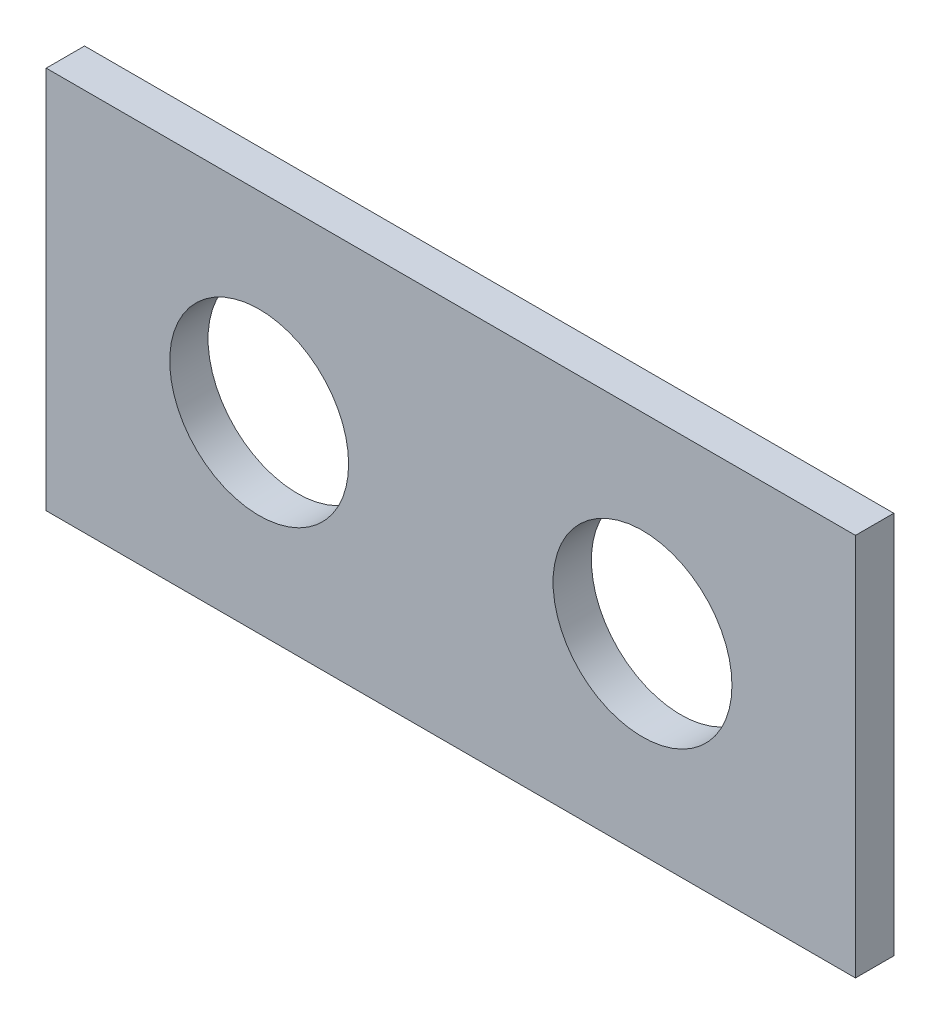
ISO-10303-21;
HEADER;
FILE_DESCRIPTION(('STEP AP214'),'2;1');
FILE_NAME('part.step','',(''),(''),'','','');
FILE_SCHEMA(('AUTOMOTIVE_DESIGN { 1 0 10303 214 1 1 1 1 }'));
ENDSEC;
DATA;
#1=APPLICATION_CONTEXT('core data for automotive mechanical design processes');
#2=APPLICATION_PROTOCOL_DEFINITION('international standard','automotive_design',2000,#1);
#3=PRODUCT_CONTEXT('',#1,'mechanical');
#4=PRODUCT('Part','Part','',(#3));
#5=PRODUCT_RELATED_PRODUCT_CATEGORY('part','',(#4));
#6=PRODUCT_DEFINITION_FORMATION('','',#4);
#7=PRODUCT_DEFINITION_CONTEXT('part definition',#1,'design');
#8=PRODUCT_DEFINITION('design','',#6,#7);
#9=PRODUCT_DEFINITION_SHAPE('','',#8);
#10=(LENGTH_UNIT() NAMED_UNIT(*) SI_UNIT(.MILLI.,.METRE.));
#11=(NAMED_UNIT(*) PLANE_ANGLE_UNIT() SI_UNIT($,.RADIAN.));
#12=(NAMED_UNIT(*) SI_UNIT($,.STERADIAN.) SOLID_ANGLE_UNIT());
#13=UNCERTAINTY_MEASURE_WITH_UNIT(LENGTH_MEASURE(1.E-05),#10,'distance_accuracy_value','');
#14=(GEOMETRIC_REPRESENTATION_CONTEXT(3) GLOBAL_UNCERTAINTY_ASSIGNED_CONTEXT((#13)) GLOBAL_UNIT_ASSIGNED_CONTEXT((#10,
#11,#12)) REPRESENTATION_CONTEXT('',''));
#15=CARTESIAN_POINT('',(0.,0.,0.));
#16=DIRECTION('',(0.,0.,1.));
#17=DIRECTION('',(1.,0.,0.));
#18=AXIS2_PLACEMENT_3D('',#15,#16,#17);
#19=CARTESIAN_POINT('',(0.,0.,0.45));
#20=DIRECTION('',(0.,0.,1.));
#21=DIRECTION('',(1.,0.,0.));
#22=AXIS2_PLACEMENT_3D('',#19,#20,#21);
#23=PLANE('',#22);
#24=CARTESIAN_POINT('',(-4.5,0.,0.45));
#25=DIRECTION('',(0.,0.,1.));
#26=DIRECTION('',(1.,0.,0.));
#27=AXIS2_PLACEMENT_3D('',#24,#25,#26);
#28=CIRCLE('',#27,2.1);
#29=CARTESIAN_POINT('',(-2.4,0.,0.45));
#30=VERTEX_POINT('',#29);
#31=EDGE_CURVE('E85',#30,#30,#28,.F.);
#32=ORIENTED_EDGE('',*,*,#31,.T.);
#33=EDGE_LOOP('',(#32));
#34=FACE_BOUND('',#33,.T.);
#35=CARTESIAN_POINT('',(4.5,0.,0.45));
#36=DIRECTION('',(0.,0.,1.));
#37=DIRECTION('',(1.,0.,0.));
#38=AXIS2_PLACEMENT_3D('',#35,#36,#37);
#39=CIRCLE('',#38,2.1);
#40=CARTESIAN_POINT('',(6.6,0.,0.45));
#41=VERTEX_POINT('',#40);
#42=EDGE_CURVE('E20',#41,#41,#39,.F.);
#43=ORIENTED_EDGE('',*,*,#42,.T.);
#44=EDGE_LOOP('',(#43));
#45=FACE_BOUND('',#44,.T.);
#46=DIRECTION('',(0.,1.,0.));
#47=VECTOR('',#46,1.);
#48=CARTESIAN_POINT('',(9.5,4.5,0.45));
#49=LINE('',#48,#47);
#50=CARTESIAN_POINT('',(9.5,4.5,0.45));
#51=VERTEX_POINT('',#50);
#52=CARTESIAN_POINT('',(9.5,-4.5,0.45));
#53=VERTEX_POINT('',#52);
#54=EDGE_CURVE('E71',#51,#53,#49,.F.);
#55=ORIENTED_EDGE('',*,*,#54,.F.);
#56=DIRECTION('',(1.,0.,0.));
#57=VECTOR('',#56,1.);
#58=CARTESIAN_POINT('',(-10.25,4.5,0.45));
#59=LINE('',#58,#57);
#60=CARTESIAN_POINT('',(-9.5,4.5,0.45));
#61=VERTEX_POINT('',#60);
#62=EDGE_CURVE('E68',#61,#51,#59,.T.);
#63=ORIENTED_EDGE('',*,*,#62,.F.);
#64=DIRECTION('',(0.,1.,0.));
#65=VECTOR('',#64,1.);
#66=CARTESIAN_POINT('',(-9.5,-4.5,0.45));
#67=LINE('',#66,#65);
#68=CARTESIAN_POINT('',(-9.5,-4.5,0.45));
#69=VERTEX_POINT('',#68);
#70=EDGE_CURVE('E59',#69,#61,#67,.T.);
#71=ORIENTED_EDGE('',*,*,#70,.F.);
#72=DIRECTION('',(1.,0.,0.));
#73=VECTOR('',#72,1.);
#74=CARTESIAN_POINT('',(10.25,-4.5,0.45));
#75=LINE('',#74,#73);
#76=EDGE_CURVE('E54',#53,#69,#75,.F.);
#77=ORIENTED_EDGE('',*,*,#76,.F.);
#78=EDGE_LOOP('',(#55,#63,#71,#77));
#79=FACE_BOUND('',#78,.T.);
#80=ADVANCED_FACE('F17',(#34,#45,#79),#23,.T.);
#81=CARTESIAN_POINT('',(-10.25,4.5,0.));
#82=DIRECTION('',(0.,1.,0.));
#83=DIRECTION('',(0.,0.,1.));
#84=AXIS2_PLACEMENT_3D('',#81,#82,#83);
#85=PLANE('',#84);
#86=DIRECTION('',(1.,0.,0.));
#87=VECTOR('',#86,1.);
#88=CARTESIAN_POINT('',(0.,4.5,-0.45));
#89=LINE('',#88,#87);
#90=CARTESIAN_POINT('',(9.5,4.5,-0.45));
#91=VERTEX_POINT('',#90);
#92=CARTESIAN_POINT('',(-9.5,4.5,-0.45));
#93=VERTEX_POINT('',#92);
#94=EDGE_CURVE('E78',#91,#93,#89,.F.);
#95=ORIENTED_EDGE('',*,*,#94,.T.);
#96=DIRECTION('',(0.,0.,1.));
#97=VECTOR('',#96,1.);
#98=CARTESIAN_POINT('',(-9.5,4.5,0.));
#99=LINE('',#98,#97);
#100=EDGE_CURVE('E64',#61,#93,#99,.F.);
#101=ORIENTED_EDGE('',*,*,#100,.F.);
#102=ORIENTED_EDGE('',*,*,#62,.T.);
#103=DIRECTION('',(0.,0.,-1.));
#104=VECTOR('',#103,1.);
#105=CARTESIAN_POINT('',(9.5,4.5,0.));
#106=LINE('',#105,#104);
#107=EDGE_CURVE('E92',#91,#51,#106,.F.);
#108=ORIENTED_EDGE('',*,*,#107,.F.);
#109=EDGE_LOOP('',(#95,#101,#102,#108));
#110=FACE_BOUND('',#109,.T.);
#111=ADVANCED_FACE('F77',(#110),#85,.T.);
#112=CARTESIAN_POINT('',(-9.5,-4.5,0.));
#113=DIRECTION('',(-1.,0.,0.));
#114=DIRECTION('',(0.,0.,1.));
#115=AXIS2_PLACEMENT_3D('',#112,#113,#114);
#116=PLANE('',#115);
#117=DIRECTION('',(0.,1.,0.));
#118=VECTOR('',#117,1.);
#119=CARTESIAN_POINT('',(-9.5,0.,-0.45));
#120=LINE('',#119,#118);
#121=CARTESIAN_POINT('',(-9.5,-4.5,-0.45));
#122=VERTEX_POINT('',#121);
#123=EDGE_CURVE('E89',#93,#122,#120,.F.);
#124=ORIENTED_EDGE('',*,*,#123,.T.);
#125=DIRECTION('',(0.,0.,-1.));
#126=VECTOR('',#125,1.);
#127=CARTESIAN_POINT('',(-9.5,-4.5,0.));
#128=LINE('',#127,#126);
#129=EDGE_CURVE('E66',#69,#122,#128,.T.);
#130=ORIENTED_EDGE('',*,*,#129,.F.);
#131=ORIENTED_EDGE('',*,*,#70,.T.);
#132=ORIENTED_EDGE('',*,*,#100,.T.);
#133=EDGE_LOOP('',(#124,#130,#131,#132));
#134=FACE_BOUND('',#133,.T.);
#135=ADVANCED_FACE('F62',(#134),#116,.T.);
#136=CARTESIAN_POINT('',(10.25,-4.5,0.));
#137=DIRECTION('',(0.,-1.,0.));
#138=DIRECTION('',(0.,0.,-1.));
#139=AXIS2_PLACEMENT_3D('',#136,#137,#138);
#140=PLANE('',#139);
#141=DIRECTION('',(1.,0.,0.));
#142=VECTOR('',#141,1.);
#143=CARTESIAN_POINT('',(0.,-4.5,-0.45));
#144=LINE('',#143,#142);
#145=CARTESIAN_POINT('',(9.5,-4.5,-0.45));
#146=VERTEX_POINT('',#145);
#147=EDGE_CURVE('E102',#122,#146,#144,.T.);
#148=ORIENTED_EDGE('',*,*,#147,.T.);
#149=DIRECTION('',(0.,0.,-1.));
#150=VECTOR('',#149,1.);
#151=CARTESIAN_POINT('',(9.5,-4.5,0.));
#152=LINE('',#151,#150);
#153=EDGE_CURVE('E35',#53,#146,#152,.T.);
#154=ORIENTED_EDGE('',*,*,#153,.F.);
#155=ORIENTED_EDGE('',*,*,#76,.T.);
#156=ORIENTED_EDGE('',*,*,#129,.T.);
#157=EDGE_LOOP('',(#148,#154,#155,#156));
#158=FACE_BOUND('',#157,.T.);
#159=ADVANCED_FACE('F101',(#158),#140,.T.);
#160=CARTESIAN_POINT('',(9.5,4.5,0.));
#161=DIRECTION('',(1.,0.,0.));
#162=DIRECTION('',(0.,0.,-1.));
#163=AXIS2_PLACEMENT_3D('',#160,#161,#162);
#164=PLANE('',#163);
#165=DIRECTION('',(0.,1.,0.));
#166=VECTOR('',#165,1.);
#167=CARTESIAN_POINT('',(9.5,0.,-0.45));
#168=LINE('',#167,#166);
#169=EDGE_CURVE('E84',#146,#91,#168,.T.);
#170=ORIENTED_EDGE('',*,*,#169,.T.);
#171=ORIENTED_EDGE('',*,*,#107,.T.);
#172=ORIENTED_EDGE('',*,*,#54,.T.);
#173=ORIENTED_EDGE('',*,*,#153,.T.);
#174=EDGE_LOOP('',(#170,#171,#172,#173));
#175=FACE_BOUND('',#174,.T.);
#176=ADVANCED_FACE('F107',(#175),#164,.T.);
#177=CARTESIAN_POINT('',(4.5,0.,0.));
#178=DIRECTION('',(0.,0.,1.));
#179=DIRECTION('',(1.,0.,0.));
#180=AXIS2_PLACEMENT_3D('',#177,#178,#179);
#181=CYLINDRICAL_SURFACE('',#180,2.1);
#182=ORIENTED_EDGE('',*,*,#42,.F.);
#183=EDGE_LOOP('',(#182));
#184=FACE_BOUND('',#183,.T.);
#185=CARTESIAN_POINT('',(4.5,0.,-0.45));
#186=DIRECTION('',(0.,0.,1.));
#187=DIRECTION('',(1.,0.,0.));
#188=AXIS2_PLACEMENT_3D('',#185,#186,#187);
#189=CIRCLE('',#188,2.1);
#190=CARTESIAN_POINT('',(6.6,0.,-0.45));
#191=VERTEX_POINT('',#190);
#192=EDGE_CURVE('E26',#191,#191,#189,.F.);
#193=ORIENTED_EDGE('',*,*,#192,.T.);
#194=EDGE_LOOP('',(#193));
#195=FACE_BOUND('',#194,.T.);
#196=ADVANCED_FACE('F109',(#184,#195),#181,.F.);
#197=CARTESIAN_POINT('',(-4.5,0.,0.));
#198=DIRECTION('',(0.,0.,1.));
#199=DIRECTION('',(1.,0.,0.));
#200=AXIS2_PLACEMENT_3D('',#197,#198,#199);
#201=CYLINDRICAL_SURFACE('',#200,2.1);
#202=ORIENTED_EDGE('',*,*,#31,.F.);
#203=EDGE_LOOP('',(#202));
#204=FACE_BOUND('',#203,.T.);
#205=CARTESIAN_POINT('',(-4.5,0.,-0.45));
#206=DIRECTION('',(0.,0.,1.));
#207=DIRECTION('',(1.,0.,0.));
#208=AXIS2_PLACEMENT_3D('',#205,#206,#207);
#209=CIRCLE('',#208,2.1);
#210=CARTESIAN_POINT('',(-2.4,0.,-0.45));
#211=VERTEX_POINT('',#210);
#212=EDGE_CURVE('E11',#211,#211,#209,.F.);
#213=ORIENTED_EDGE('',*,*,#212,.T.);
#214=EDGE_LOOP('',(#213));
#215=FACE_BOUND('',#214,.T.);
#216=ADVANCED_FACE('F116',(#204,#215),#201,.F.);
#217=CARTESIAN_POINT('',(0.,0.,-0.45));
#218=DIRECTION('',(0.,0.,1.));
#219=DIRECTION('',(1.,0.,0.));
#220=AXIS2_PLACEMENT_3D('',#217,#218,#219);
#221=PLANE('',#220);
#222=ORIENTED_EDGE('',*,*,#212,.F.);
#223=EDGE_LOOP('',(#222));
#224=FACE_BOUND('',#223,.T.);
#225=ORIENTED_EDGE('',*,*,#192,.F.);
#226=EDGE_LOOP('',(#225));
#227=FACE_BOUND('',#226,.T.);
#228=ORIENTED_EDGE('',*,*,#147,.F.);
#229=ORIENTED_EDGE('',*,*,#123,.F.);
#230=ORIENTED_EDGE('',*,*,#94,.F.);
#231=ORIENTED_EDGE('',*,*,#169,.F.);
#232=EDGE_LOOP('',(#228,#229,#230,#231));
#233=FACE_BOUND('',#232,.T.);
#234=ADVANCED_FACE('F104',(#224,#227,#233),#221,.F.);
#235=CLOSED_SHELL('',(#80,#111,#135,#159,#176,#196,#216,#234));
#236=MANIFOLD_SOLID_BREP('B1',#235);
#237=ADVANCED_BREP_SHAPE_REPRESENTATION('',(#18,#236),#14);
#238=SHAPE_DEFINITION_REPRESENTATION(#9,#237);
ENDSEC;
END-ISO-10303-21;
